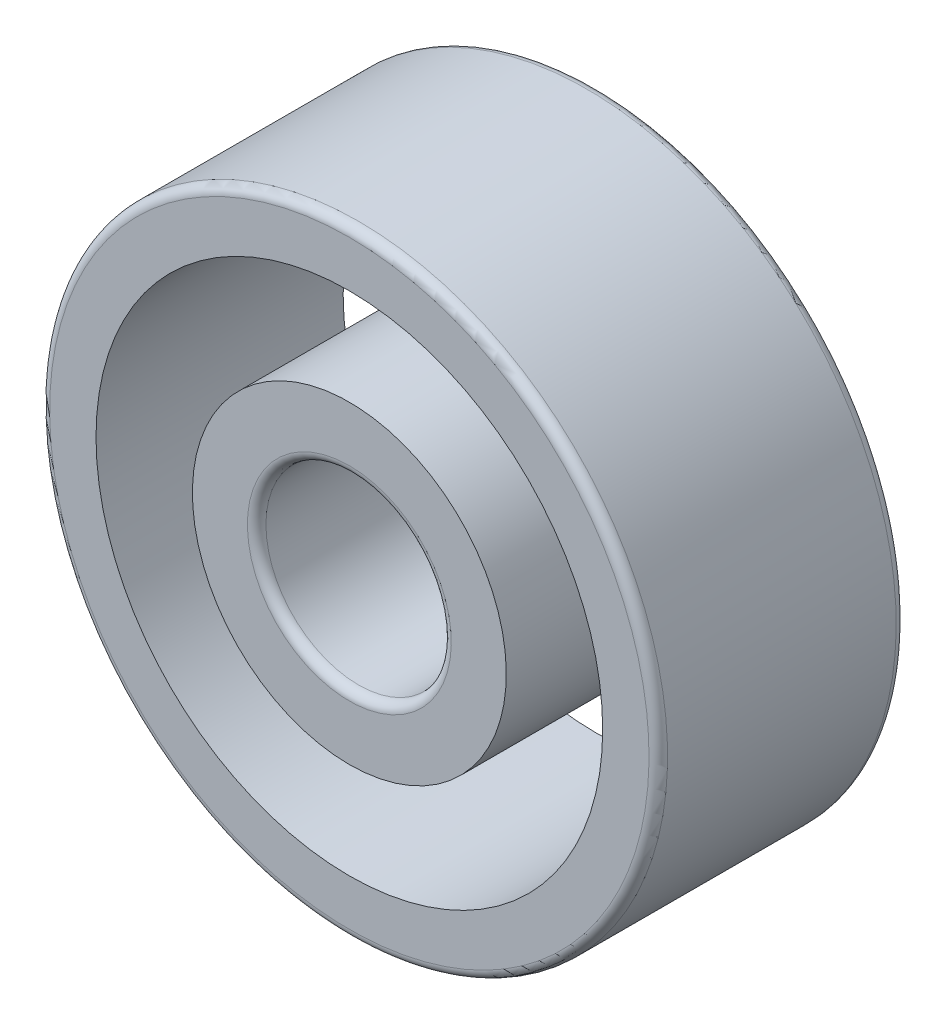
ISO-10303-21;
HEADER;
FILE_DESCRIPTION(('STEP AP214'),'2;1');
FILE_NAME('part.step','',(''),(''),'','','');
FILE_SCHEMA(('AUTOMOTIVE_DESIGN { 1 0 10303 214 1 1 1 1 }'));
ENDSEC;
DATA;
#1=APPLICATION_CONTEXT('core data for automotive mechanical design processes');
#2=APPLICATION_PROTOCOL_DEFINITION('international standard','automotive_design',2000,#1);
#3=PRODUCT_CONTEXT('',#1,'mechanical');
#4=PRODUCT('Part','Part','',(#3));
#5=PRODUCT_RELATED_PRODUCT_CATEGORY('part','',(#4));
#6=PRODUCT_DEFINITION_FORMATION('','',#4);
#7=PRODUCT_DEFINITION_CONTEXT('part definition',#1,'design');
#8=PRODUCT_DEFINITION('design','',#6,#7);
#9=PRODUCT_DEFINITION_SHAPE('','',#8);
#10=(LENGTH_UNIT() NAMED_UNIT(*) SI_UNIT(.MILLI.,.METRE.));
#11=(NAMED_UNIT(*) PLANE_ANGLE_UNIT() SI_UNIT($,.RADIAN.));
#12=(NAMED_UNIT(*) SI_UNIT($,.STERADIAN.) SOLID_ANGLE_UNIT());
#13=UNCERTAINTY_MEASURE_WITH_UNIT(LENGTH_MEASURE(1.E-05),#10,'distance_accuracy_value','');
#14=(GEOMETRIC_REPRESENTATION_CONTEXT(3) GLOBAL_UNCERTAINTY_ASSIGNED_CONTEXT((#13)) GLOBAL_UNIT_ASSIGNED_CONTEXT((#10,
#11,#12)) REPRESENTATION_CONTEXT('',''));
#15=CARTESIAN_POINT('',(0.,0.,0.));
#16=DIRECTION('',(0.,0.,1.));
#17=DIRECTION('',(1.,0.,0.));
#18=AXIS2_PLACEMENT_3D('',#15,#16,#17);
#19=CARTESIAN_POINT('',(0.,2.54,2.));
#20=DIRECTION('',(0.,0.,-1.));
#21=DIRECTION('',(0.,1.,0.));
#22=AXIS2_PLACEMENT_3D('',#19,#20,#21);
#23=PLANE('',#22);
#24=CARTESIAN_POINT('',(0.,0.,2.));
#25=DIRECTION('',(0.,0.,-1.));
#26=DIRECTION('',(0.,1.,0.));
#27=AXIS2_PLACEMENT_3D('',#24,#25,#26);
#28=CIRCLE('',#27,1.65);
#29=CARTESIAN_POINT('',(0.,1.65,2.));
#30=VERTEX_POINT('',#29);
#31=EDGE_CURVE('E11',#30,#30,#28,.T.);
#32=ORIENTED_EDGE('',*,*,#31,.T.);
#33=EDGE_LOOP('',(#32));
#34=FACE_BOUND('',#33,.T.);
#35=CARTESIAN_POINT('',(0.,0.,2.));
#36=DIRECTION('',(0.,0.,1.));
#37=DIRECTION('',(0.,-1.,0.));
#38=AXIS2_PLACEMENT_3D('',#35,#36,#37);
#39=CIRCLE('',#38,2.54);
#40=CARTESIAN_POINT('',(0.,-2.54,2.));
#41=VERTEX_POINT('',#40);
#42=EDGE_CURVE('E62',#41,#41,#39,.T.);
#43=ORIENTED_EDGE('',*,*,#42,.T.);
#44=EDGE_LOOP('',(#43));
#45=FACE_BOUND('',#44,.T.);
#46=ADVANCED_FACE('F39',(#34,#45),#23,.F.);
#47=CARTESIAN_POINT('',(0.,0.,2.));
#48=DIRECTION('',(0.,0.,1.));
#49=DIRECTION('',(0.,-1.,0.));
#50=AXIS2_PLACEMENT_3D('',#47,#48,#49);
#51=CYLINDRICAL_SURFACE('',#50,1.5);
#52=CARTESIAN_POINT('',(0.,0.,-1.85));
#53=DIRECTION('',(0.,0.,1.));
#54=DIRECTION('',(0.,-1.,0.));
#55=AXIS2_PLACEMENT_3D('',#52,#53,#54);
#56=CIRCLE('',#55,1.5);
#57=CARTESIAN_POINT('',(0.,-1.5,-1.85));
#58=VERTEX_POINT('',#57);
#59=EDGE_CURVE('E46',#58,#58,#56,.F.);
#60=ORIENTED_EDGE('',*,*,#59,.T.);
#61=EDGE_LOOP('',(#60));
#62=FACE_BOUND('',#61,.T.);
#63=CARTESIAN_POINT('',(0.,0.,1.85));
#64=DIRECTION('',(0.,0.,-1.));
#65=DIRECTION('',(0.,1.,0.));
#66=AXIS2_PLACEMENT_3D('',#63,#64,#65);
#67=CIRCLE('',#66,1.5);
#68=CARTESIAN_POINT('',(0.,1.5,1.85));
#69=VERTEX_POINT('',#68);
#70=EDGE_CURVE('E50',#69,#69,#67,.F.);
#71=ORIENTED_EDGE('',*,*,#70,.T.);
#72=EDGE_LOOP('',(#71));
#73=FACE_BOUND('',#72,.T.);
#74=ADVANCED_FACE('F76',(#62,#73),#51,.F.);
#75=CARTESIAN_POINT('',(0.,2.54,-2.));
#76=DIRECTION('',(0.,0.,1.));
#77=DIRECTION('',(0.,-1.,0.));
#78=AXIS2_PLACEMENT_3D('',#75,#76,#77);
#79=PLANE('',#78);
#80=CARTESIAN_POINT('',(0.,0.,-2.));
#81=DIRECTION('',(0.,0.,1.));
#82=DIRECTION('',(0.,-1.,0.));
#83=AXIS2_PLACEMENT_3D('',#80,#81,#82);
#84=CIRCLE('',#83,1.65);
#85=CARTESIAN_POINT('',(0.,-1.65,-2.));
#86=VERTEX_POINT('',#85);
#87=EDGE_CURVE('E54',#86,#86,#84,.T.);
#88=ORIENTED_EDGE('',*,*,#87,.T.);
#89=EDGE_LOOP('',(#88));
#90=FACE_BOUND('',#89,.T.);
#91=CARTESIAN_POINT('',(0.,0.,-2.));
#92=DIRECTION('',(0.,0.,1.));
#93=DIRECTION('',(0.,-1.,0.));
#94=AXIS2_PLACEMENT_3D('',#91,#92,#93);
#95=CIRCLE('',#94,2.54);
#96=CARTESIAN_POINT('',(0.,-2.54,-2.));
#97=VERTEX_POINT('',#96);
#98=EDGE_CURVE('E59',#97,#97,#95,.T.);
#99=ORIENTED_EDGE('',*,*,#98,.F.);
#100=EDGE_LOOP('',(#99));
#101=FACE_BOUND('',#100,.T.);
#102=ADVANCED_FACE('F71',(#90,#101),#79,.F.);
#103=CARTESIAN_POINT('',(0.,0.,2.));
#104=DIRECTION('',(0.,0.,1.));
#105=DIRECTION('',(0.,-1.,0.));
#106=AXIS2_PLACEMENT_3D('',#103,#104,#105);
#107=CYLINDRICAL_SURFACE('',#106,2.54);
#108=ORIENTED_EDGE('',*,*,#42,.F.);
#109=EDGE_LOOP('',(#108));
#110=FACE_BOUND('',#109,.T.);
#111=ORIENTED_EDGE('',*,*,#98,.T.);
#112=EDGE_LOOP('',(#111));
#113=FACE_BOUND('',#112,.T.);
#114=ADVANCED_FACE('F67',(#110,#113),#107,.T.);
#115=CARTESIAN_POINT('',(0.,0.,-1.85));
#116=DIRECTION('',(0.,0.,1.));
#117=DIRECTION('',(0.,-1.,0.));
#118=AXIS2_PLACEMENT_3D('',#115,#116,#117);
#119=TOROIDAL_SURFACE('',#118,1.65,0.15);
#120=ORIENTED_EDGE('',*,*,#59,.F.);
#121=EDGE_LOOP('',(#120));
#122=FACE_BOUND('',#121,.T.);
#123=ORIENTED_EDGE('',*,*,#87,.F.);
#124=EDGE_LOOP('',(#123));
#125=FACE_BOUND('',#124,.T.);
#126=ADVANCED_FACE('F70',(#122,#125),#119,.T.);
#127=CARTESIAN_POINT('',(0.,0.,1.85));
#128=DIRECTION('',(0.,0.,-1.));
#129=DIRECTION('',(0.,1.,0.));
#130=AXIS2_PLACEMENT_3D('',#127,#128,#129);
#131=TOROIDAL_SURFACE('',#130,1.65,0.15);
#132=ORIENTED_EDGE('',*,*,#31,.F.);
#133=EDGE_LOOP('',(#132));
#134=FACE_BOUND('',#133,.T.);
#135=ORIENTED_EDGE('',*,*,#70,.F.);
#136=EDGE_LOOP('',(#135));
#137=FACE_BOUND('',#136,.T.);
#138=ADVANCED_FACE('F41',(#134,#137),#131,.T.);
#139=CLOSED_SHELL('',(#46,#74,#102,#114,#126,#138));
#140=MANIFOLD_SOLID_BREP('B2',#139);
#141=CARTESIAN_POINT('',(0.,5.,2.));
#142=DIRECTION('',(0.,0.,-1.));
#143=DIRECTION('',(0.,1.,0.));
#144=AXIS2_PLACEMENT_3D('',#141,#142,#143);
#145=PLANE('',#144);
#146=CARTESIAN_POINT('',(0.,0.,2.));
#147=DIRECTION('',(0.,0.,-1.));
#148=DIRECTION('',(0.,1.,0.));
#149=AXIS2_PLACEMENT_3D('',#146,#147,#148);
#150=CIRCLE('',#149,4.85);
#151=CARTESIAN_POINT('',(0.,4.85,2.));
#152=VERTEX_POINT('',#151);
#153=EDGE_CURVE('E38',#152,#152,#150,.F.);
#154=ORIENTED_EDGE('',*,*,#153,.T.);
#155=EDGE_LOOP('',(#154));
#156=FACE_BOUND('',#155,.T.);
#157=CARTESIAN_POINT('',(0.,0.,2.));
#158=DIRECTION('',(0.,0.,1.));
#159=DIRECTION('',(0.,-1.,0.));
#160=AXIS2_PLACEMENT_3D('',#157,#158,#159);
#161=CIRCLE('',#160,4.1);
#162=CARTESIAN_POINT('',(0.,-4.1,2.));
#163=VERTEX_POINT('',#162);
#164=EDGE_CURVE('E151',#163,#163,#161,.T.);
#165=ORIENTED_EDGE('',*,*,#164,.F.);
#166=EDGE_LOOP('',(#165));
#167=FACE_BOUND('',#166,.T.);
#168=ADVANCED_FACE('F131',(#156,#167),#145,.F.);
#169=CARTESIAN_POINT('',(0.,0.,2.));
#170=DIRECTION('',(0.,0.,1.));
#171=DIRECTION('',(0.,-1.,0.));
#172=AXIS2_PLACEMENT_3D('',#169,#170,#171);
#173=CYLINDRICAL_SURFACE('',#172,4.1);
#174=CARTESIAN_POINT('',(0.,0.,-2.));
#175=DIRECTION('',(0.,0.,1.));
#176=DIRECTION('',(0.,-1.,0.));
#177=AXIS2_PLACEMENT_3D('',#174,#175,#176);
#178=CIRCLE('',#177,4.1);
#179=CARTESIAN_POINT('',(0.,-4.1,-2.));
#180=VERTEX_POINT('',#179);
#181=EDGE_CURVE('E154',#180,#180,#178,.T.);
#182=ORIENTED_EDGE('',*,*,#181,.F.);
#183=EDGE_LOOP('',(#182));
#184=FACE_BOUND('',#183,.T.);
#185=ORIENTED_EDGE('',*,*,#164,.T.);
#186=EDGE_LOOP('',(#185));
#187=FACE_BOUND('',#186,.T.);
#188=ADVANCED_FACE('F160',(#184,#187),#173,.F.);
#189=CARTESIAN_POINT('',(0.,5.,-2.));
#190=DIRECTION('',(0.,0.,1.));
#191=DIRECTION('',(0.,-1.,0.));
#192=AXIS2_PLACEMENT_3D('',#189,#190,#191);
#193=PLANE('',#192);
#194=CARTESIAN_POINT('',(0.,0.,-2.));
#195=DIRECTION('',(0.,0.,1.));
#196=DIRECTION('',(0.,-1.,0.));
#197=AXIS2_PLACEMENT_3D('',#194,#195,#196);
#198=CIRCLE('',#197,4.85);
#199=CARTESIAN_POINT('',(0.,-4.85,-2.));
#200=VERTEX_POINT('',#199);
#201=EDGE_CURVE('E138',#200,#200,#198,.F.);
#202=ORIENTED_EDGE('',*,*,#201,.T.);
#203=EDGE_LOOP('',(#202));
#204=FACE_BOUND('',#203,.T.);
#205=ORIENTED_EDGE('',*,*,#181,.T.);
#206=EDGE_LOOP('',(#205));
#207=FACE_BOUND('',#206,.T.);
#208=ADVANCED_FACE('F158',(#204,#207),#193,.F.);
#209=CARTESIAN_POINT('',(0.,0.,2.));
#210=DIRECTION('',(0.,0.,1.));
#211=DIRECTION('',(0.,-1.,0.));
#212=AXIS2_PLACEMENT_3D('',#209,#210,#211);
#213=CYLINDRICAL_SURFACE('',#212,5.);
#214=CARTESIAN_POINT('',(0.,0.,-1.85));
#215=DIRECTION('',(0.,0.,1.));
#216=DIRECTION('',(0.,-1.,0.));
#217=AXIS2_PLACEMENT_3D('',#214,#215,#216);
#218=CIRCLE('',#217,5.);
#219=CARTESIAN_POINT('',(0.,-5.,-1.85));
#220=VERTEX_POINT('',#219);
#221=EDGE_CURVE('E142',#220,#220,#218,.T.);
#222=ORIENTED_EDGE('',*,*,#221,.T.);
#223=EDGE_LOOP('',(#222));
#224=FACE_BOUND('',#223,.T.);
#225=CARTESIAN_POINT('',(0.,0.,1.85));
#226=DIRECTION('',(0.,0.,-1.));
#227=DIRECTION('',(0.,1.,0.));
#228=AXIS2_PLACEMENT_3D('',#225,#226,#227);
#229=CIRCLE('',#228,5.);
#230=CARTESIAN_POINT('',(0.,5.,1.85));
#231=VERTEX_POINT('',#230);
#232=EDGE_CURVE('E146',#231,#231,#229,.T.);
#233=ORIENTED_EDGE('',*,*,#232,.T.);
#234=EDGE_LOOP('',(#233));
#235=FACE_BOUND('',#234,.T.);
#236=ADVANCED_FACE('F173',(#224,#235),#213,.T.);
#237=CARTESIAN_POINT('',(0.,0.,-1.85));
#238=DIRECTION('',(0.,0.,1.));
#239=DIRECTION('',(0.,-1.,0.));
#240=AXIS2_PLACEMENT_3D('',#237,#238,#239);
#241=TOROIDAL_SURFACE('',#240,4.85,0.15);
#242=ORIENTED_EDGE('',*,*,#201,.F.);
#243=EDGE_LOOP('',(#242));
#244=FACE_BOUND('',#243,.T.);
#245=ORIENTED_EDGE('',*,*,#221,.F.);
#246=EDGE_LOOP('',(#245));
#247=FACE_BOUND('',#246,.T.);
#248=ADVANCED_FACE('F171',(#244,#247),#241,.T.);
#249=CARTESIAN_POINT('',(0.,0.,1.85));
#250=DIRECTION('',(0.,0.,-1.));
#251=DIRECTION('',(0.,1.,0.));
#252=AXIS2_PLACEMENT_3D('',#249,#250,#251);
#253=TOROIDAL_SURFACE('',#252,4.85,0.15);
#254=ORIENTED_EDGE('',*,*,#232,.F.);
#255=EDGE_LOOP('',(#254));
#256=FACE_BOUND('',#255,.T.);
#257=ORIENTED_EDGE('',*,*,#153,.F.);
#258=EDGE_LOOP('',(#257));
#259=FACE_BOUND('',#258,.T.);
#260=ADVANCED_FACE('F133',(#256,#259),#253,.T.);
#261=CLOSED_SHELL('',(#168,#188,#208,#236,#248,#260));
#262=MANIFOLD_SOLID_BREP('B6',#261);
#263=ADVANCED_BREP_SHAPE_REPRESENTATION('',(#18,#140,#262),#14);
#264=SHAPE_DEFINITION_REPRESENTATION(#9,#263);
ENDSEC;
END-ISO-10303-21;
